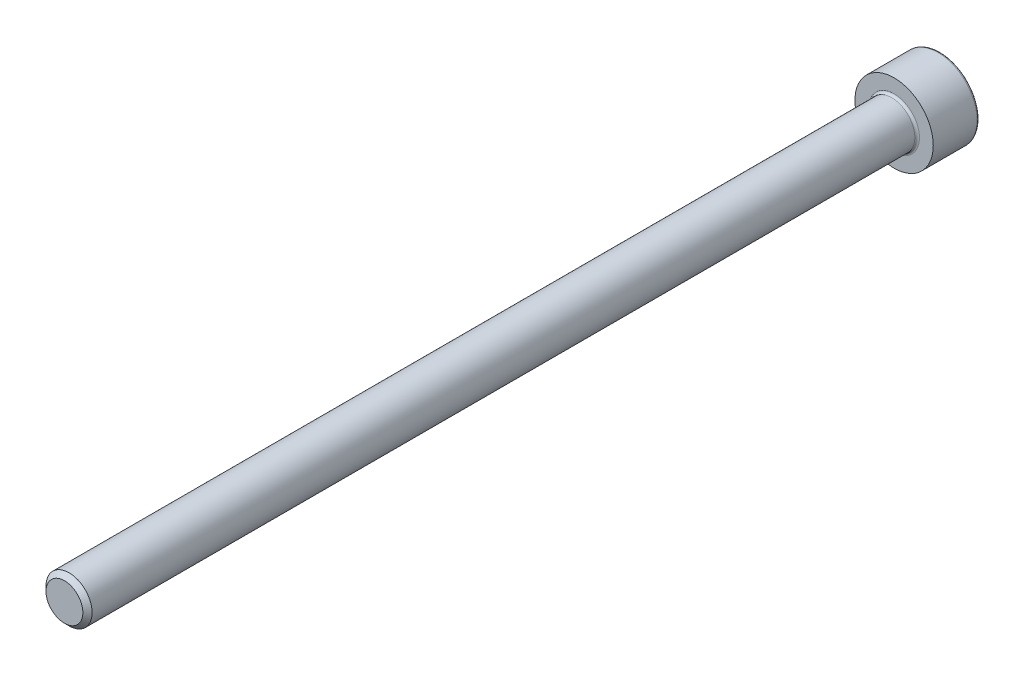
ISO-10303-21;
HEADER;
FILE_DESCRIPTION(('STEP AP214'),'2;1');
FILE_NAME('part.step','',(''),(''),'','','');
FILE_SCHEMA(('AUTOMOTIVE_DESIGN { 1 0 10303 214 1 1 1 1 }'));
ENDSEC;
DATA;
#1=APPLICATION_CONTEXT('core data for automotive mechanical design processes');
#2=APPLICATION_PROTOCOL_DEFINITION('international standard','automotive_design',2000,#1);
#3=PRODUCT_CONTEXT('',#1,'mechanical');
#4=PRODUCT('Part','Part','',(#3));
#5=PRODUCT_RELATED_PRODUCT_CATEGORY('part','',(#4));
#6=PRODUCT_DEFINITION_FORMATION('','',#4);
#7=PRODUCT_DEFINITION_CONTEXT('part definition',#1,'design');
#8=PRODUCT_DEFINITION('design','',#6,#7);
#9=PRODUCT_DEFINITION_SHAPE('','',#8);
#10=(LENGTH_UNIT() NAMED_UNIT(*) SI_UNIT(.MILLI.,.METRE.));
#11=(NAMED_UNIT(*) PLANE_ANGLE_UNIT() SI_UNIT($,.RADIAN.));
#12=(NAMED_UNIT(*) SI_UNIT($,.STERADIAN.) SOLID_ANGLE_UNIT());
#13=UNCERTAINTY_MEASURE_WITH_UNIT(LENGTH_MEASURE(1.E-05),#10,'distance_accuracy_value','');
#14=(GEOMETRIC_REPRESENTATION_CONTEXT(3) GLOBAL_UNCERTAINTY_ASSIGNED_CONTEXT((#13)) GLOBAL_UNIT_ASSIGNED_CONTEXT((#10,
#11,#12)) REPRESENTATION_CONTEXT('',''));
#15=CARTESIAN_POINT('',(0.,0.,0.));
#16=DIRECTION('',(0.,0.,1.));
#17=DIRECTION('',(1.,0.,0.));
#18=AXIS2_PLACEMENT_3D('',#15,#16,#17);
#19=CARTESIAN_POINT('',(0.,0.,-92.5));
#20=DIRECTION('',(0.,0.,1.));
#21=DIRECTION('',(1.,0.,0.));
#22=AXIS2_PLACEMENT_3D('',#19,#20,#21);
#23=PLANE('',#22);
#24=CARTESIAN_POINT('',(0.,0.,-92.5000000011473));
#25=DIRECTION('',(0.,0.,-1.));
#26=DIRECTION('',(-1.,0.,0.));
#27=AXIS2_PLACEMENT_3D('',#24,#25,#26);
#28=CIRCLE('',#27,1.99999999935001);
#29=CARTESIAN_POINT('',(-1.73205192905795,-0.999998056863642,-92.5000000005736));
#30=VERTEX_POINT('',#29);
#31=CARTESIAN_POINT('',(-9.3085380091339E-07,-2.,-92.5000000005736));
#32=VERTEX_POINT('',#31);
#33=EDGE_CURVE('E108',#30,#32,#28,.F.);
#34=ORIENTED_EDGE('',*,*,#33,.T.);
#35=DIRECTION('',(1.,0.,0.));
#36=VECTOR('',#35,1.);
#37=CARTESIAN_POINT('',(0.,-2.,-92.5));
#38=LINE('',#37,#36);
#39=CARTESIAN_POINT('',(-1.15470053838004,-2.00000000000002,-92.5));
#40=VERTEX_POINT('',#39);
#41=EDGE_CURVE('E95',#40,#32,#38,.T.);
#42=ORIENTED_EDGE('',*,*,#41,.F.);
#43=DIRECTION('',(0.499999999995589,-0.866025403786985,0.));
#44=VECTOR('',#43,1.);
#45=CARTESIAN_POINT('',(-1.73205305112,-0.999996114045,-92.5));
#46=LINE('',#45,#44);
#47=EDGE_CURVE('E105',#30,#40,#46,.T.);
#48=ORIENTED_EDGE('',*,*,#47,.F.);
#49=EDGE_LOOP('',(#34,#42,#48));
#50=FACE_BOUND('',#49,.T.);
#51=ADVANCED_FACE('F17',(#50),#23,.F.);
#52=CARTESIAN_POINT('',(0.,0.,-92.5));
#53=DIRECTION('',(0.,0.,1.));
#54=DIRECTION('',(1.,0.,0.));
#55=AXIS2_PLACEMENT_3D('',#52,#53,#54);
#56=PLANE('',#55);
#57=CARTESIAN_POINT('',(0.,0.,-92.5000000011473));
#58=DIRECTION('',(0.,0.,-1.));
#59=DIRECTION('',(-1.,0.,0.));
#60=AXIS2_PLACEMENT_3D('',#57,#58,#59);
#61=CIRCLE('',#60,1.99999999935001);
#62=CARTESIAN_POINT('',(1.73205080756945,-0.999999999997002,-92.5000000005736));
#63=VERTEX_POINT('',#62);
#64=EDGE_CURVE('E114',#32,#63,#61,.F.);
#65=ORIENTED_EDGE('',*,*,#64,.T.);
#66=DIRECTION('',(0.49999999999734,0.866025403785975,0.));
#67=VECTOR('',#66,1.);
#68=CARTESIAN_POINT('',(1.15470053838,-2.,-92.5));
#69=LINE('',#68,#67);
#70=CARTESIAN_POINT('',(1.15470053838,-2.,-92.5));
#71=VERTEX_POINT('',#70);
#72=EDGE_CURVE('E122',#71,#63,#69,.T.);
#73=ORIENTED_EDGE('',*,*,#72,.F.);
#74=DIRECTION('',(1.,0.,0.));
#75=VECTOR('',#74,1.);
#76=CARTESIAN_POINT('',(0.,-2.,-92.5));
#77=LINE('',#76,#75);
#78=EDGE_CURVE('E100',#32,#71,#77,.T.);
#79=ORIENTED_EDGE('',*,*,#78,.F.);
#80=EDGE_LOOP('',(#65,#73,#79));
#81=FACE_BOUND('',#80,.T.);
#82=ADVANCED_FACE('F120',(#81),#56,.F.);
#83=CARTESIAN_POINT('',(0.,0.,-92.5));
#84=DIRECTION('',(0.,0.,1.));
#85=DIRECTION('',(1.,0.,0.));
#86=AXIS2_PLACEMENT_3D('',#83,#84,#85);
#87=PLANE('',#86);
#88=CARTESIAN_POINT('',(0.,0.,-92.5));
#89=DIRECTION('',(0.,0.,1.));
#90=DIRECTION('',(1.,0.,0.));
#91=AXIS2_PLACEMENT_3D('',#88,#89,#90);
#92=CIRCLE('',#91,1.99999999736283);
#93=CARTESIAN_POINT('',(1.75549951517932,-0.959052021438868,-92.5000820987267));
#94=VERTEX_POINT('',#93);
#95=CARTESIAN_POINT('',(1.7320508064274,0.999999999340952,-92.5000000005736));
#96=VERTEX_POINT('',#95);
#97=EDGE_CURVE('E130',#94,#96,#92,.T.);
#98=ORIENTED_EDGE('',*,*,#97,.T.);
#99=DIRECTION('',(-0.500000000000243,0.866025403784298,0.));
#100=VECTOR('',#99,1.);
#101=CARTESIAN_POINT('',(2.30940107676,0.,-92.5));
#102=LINE('',#101,#100);
#103=CARTESIAN_POINT('',(2.30940107675996,0.,-92.5));
#104=VERTEX_POINT('',#103);
#105=EDGE_CURVE('E123',#104,#96,#102,.T.);
#106=ORIENTED_EDGE('',*,*,#105,.F.);
#107=DIRECTION('',(0.50000000000019,0.866025403784329,0.));
#108=VECTOR('',#107,1.);
#109=CARTESIAN_POINT('',(1.15470053838,-2.,-92.5));
#110=LINE('',#109,#108);
#111=EDGE_CURVE('E140',#94,#104,#110,.T.);
#112=ORIENTED_EDGE('',*,*,#111,.F.);
#113=EDGE_LOOP('',(#98,#106,#112));
#114=FACE_BOUND('',#113,.T.);
#115=ADVANCED_FACE('F417',(#114),#87,.F.);
#116=CARTESIAN_POINT('',(0.,0.,-92.5));
#117=DIRECTION('',(0.,0.,1.));
#118=DIRECTION('',(1.,0.,0.));
#119=AXIS2_PLACEMENT_3D('',#116,#117,#118);
#120=PLANE('',#119);
#121=CARTESIAN_POINT('',(0.,0.,-92.5000000011473));
#122=DIRECTION('',(0.,0.,-1.));
#123=DIRECTION('',(-1.,0.,0.));
#124=AXIS2_PLACEMENT_3D('',#121,#122,#123);
#125=CIRCLE('',#124,1.99999999935001);
#126=CARTESIAN_POINT('',(0.,1.99999999967501,-92.5000000005736));
#127=VERTEX_POINT('',#126);
#128=EDGE_CURVE('E470',#96,#127,#125,.F.);
#129=ORIENTED_EDGE('',*,*,#128,.T.);
#130=DIRECTION('',(1.,0.,0.));
#131=VECTOR('',#130,1.);
#132=CARTESIAN_POINT('',(0.,2.,-92.5));
#133=LINE('',#132,#131);
#134=CARTESIAN_POINT('',(1.15470053838004,2.00000000000002,-92.5));
#135=VERTEX_POINT('',#134);
#136=EDGE_CURVE('E143',#135,#127,#133,.F.);
#137=ORIENTED_EDGE('',*,*,#136,.F.);
#138=DIRECTION('',(-0.500000000000243,0.866025403784298,0.));
#139=VECTOR('',#138,1.);
#140=CARTESIAN_POINT('',(1.73205080757,1.,-92.5));
#141=LINE('',#140,#139);
#142=EDGE_CURVE('E195',#96,#135,#141,.T.);
#143=ORIENTED_EDGE('',*,*,#142,.F.);
#144=EDGE_LOOP('',(#129,#137,#143));
#145=FACE_BOUND('',#144,.T.);
#146=ADVANCED_FACE('F408',(#145),#120,.F.);
#147=CARTESIAN_POINT('',(0.,0.,-92.5));
#148=DIRECTION('',(0.,0.,1.));
#149=DIRECTION('',(1.,0.,0.));
#150=AXIS2_PLACEMENT_3D('',#147,#148,#149);
#151=PLANE('',#150);
#152=CARTESIAN_POINT('',(0.,0.,-92.5000000011473));
#153=DIRECTION('',(0.,0.,-1.));
#154=DIRECTION('',(-1.,0.,0.));
#155=AXIS2_PLACEMENT_3D('',#152,#153,#154);
#156=CIRCLE('',#155,1.99999999935001);
#157=CARTESIAN_POINT('',(-1.73205080756942,1.00000000000093,-92.5000000005736));
#158=VERTEX_POINT('',#157);
#159=EDGE_CURVE('E235',#127,#158,#156,.F.);
#160=ORIENTED_EDGE('',*,*,#159,.T.);
#161=DIRECTION('',(-0.500000000000243,-0.866025403784298,0.));
#162=VECTOR('',#161,1.);
#163=CARTESIAN_POINT('',(-1.15470053838,2.,-92.5));
#164=LINE('',#163,#162);
#165=CARTESIAN_POINT('',(-1.15470053838,2.,-92.5));
#166=VERTEX_POINT('',#165);
#167=EDGE_CURVE('E191',#166,#158,#164,.T.);
#168=ORIENTED_EDGE('',*,*,#167,.F.);
#169=DIRECTION('',(1.,0.,0.));
#170=VECTOR('',#169,1.);
#171=CARTESIAN_POINT('',(0.,2.,-92.5));
#172=LINE('',#171,#170);
#173=EDGE_CURVE('E115',#127,#166,#172,.F.);
#174=ORIENTED_EDGE('',*,*,#173,.F.);
#175=EDGE_LOOP('',(#160,#168,#174));
#176=FACE_BOUND('',#175,.T.);
#177=ADVANCED_FACE('F260',(#176),#151,.F.);
#178=CARTESIAN_POINT('',(0.,0.,-92.5070898501303));
#179=DIRECTION('',(0.,0.,-1.));
#180=DIRECTION('',(-1.,0.,0.));
#181=AXIS2_PLACEMENT_3D('',#178,#179,#180);
#182=CONICAL_SURFACE('',#181,2.01227997796447,1.0471975497099);
#183=CARTESIAN_POINT('',(-3.41060513164848E-10,1.70530256582424E-10,-91.3452994597606));
#184=VERTEX_POINT('',#183);
#185=VERTEX_LOOP('',#184);
#186=FACE_BOUND('',#185,.T.);
#187=CARTESIAN_POINT('',(-1.73205080756977,1.00000000000026,-92.5000000015231));
#188=CARTESIAN_POINT('',(-1.73598288580617,0.993189440715484,-92.5000000095924));
#189=CARTESIAN_POINT('',(-1.73991487290214,0.98637903929055,-92.5000267870715));
#190=CARTESIAN_POINT('',(-1.74777866480058,0.972758552182319,-92.5001338808495));
#191=CARTESIAN_POINT('',(-1.75171046960304,0.965948466499022,-92.5002141971481));
#192=CARTESIAN_POINT('',(-1.75564218326507,0.959138538675565,-92.5003212828565));
#193=B_SPLINE_CURVE_WITH_KNOTS('',3,(#187,#188,#189,#190,#191,#192),.UNSPECIFIED.,.F.,.F.,(4,2,
4),(0.,0.0235920593447374,0.047184118613414),.UNSPECIFIED.);
#194=CARTESIAN_POINT('',(-1.7554935244544,0.959049109002411,-92.5000922635321));
#195=VERTEX_POINT('',#194);
#196=EDGE_CURVE('E182',#158,#195,#193,.T.);
#197=ORIENTED_EDGE('',*,*,#196,.F.);
#198=ORIENTED_EDGE('',*,*,#159,.F.);
#199=ORIENTED_EDGE('',*,*,#128,.F.);
#200=ORIENTED_EDGE('',*,*,#97,.F.);
#201=CARTESIAN_POINT('',(1.73205102128285,-0.99999962983835,-92.5000000015231));
#202=CARTESIAN_POINT('',(1.73598309178616,-0.993189083947678,-92.5000000105628));
#203=CARTESIAN_POINT('',(1.73991507114793,-0.986378695918774,-92.5000267889068));
#204=CARTESIAN_POINT('',(1.74777884757574,-0.972758235606456,-92.5001338842035));
#205=CARTESIAN_POINT('',(1.75171064464177,-0.965948163323043,-92.5002142011559));
#206=CARTESIAN_POINT('',(1.75564235056627,-0.959138248901396,-92.5003212874126));
#207=B_SPLINE_CURVE_WITH_KNOTS('',3,(#201,#202,#203,#204,#205,#206),.UNSPECIFIED.,.F.,.F.,(4,2,
4),(0.,0.0235920129486334,0.0471840258212055),.UNSPECIFIED.);
#208=EDGE_CURVE('E128',#63,#94,#207,.T.);
#209=ORIENTED_EDGE('',*,*,#208,.F.);
#210=ORIENTED_EDGE('',*,*,#64,.F.);
#211=ORIENTED_EDGE('',*,*,#33,.F.);
#212=CARTESIAN_POINT('',(0.,0.,-92.5));
#213=DIRECTION('',(0.,0.,1.));
#214=DIRECTION('',(1.,0.,0.));
#215=AXIS2_PLACEMENT_3D('',#212,#213,#214);
#216=CIRCLE('',#215,1.99999999736283);
#217=EDGE_CURVE('E159',#30,#195,#216,.F.);
#218=ORIENTED_EDGE('',*,*,#217,.T.);
#219=EDGE_LOOP('',(#197,#198,#199,#200,#209,#210,#211,#218));
#220=FACE_BOUND('',#219,.T.);
#221=ADVANCED_FACE('F126',(#186,#220),#182,.F.);
#222=CARTESIAN_POINT('',(0.,0.,-92.5));
#223=DIRECTION('',(0.,0.,1.));
#224=DIRECTION('',(1.,0.,0.));
#225=AXIS2_PLACEMENT_3D('',#222,#223,#224);
#226=PLANE('',#225);
#227=ORIENTED_EDGE('',*,*,#217,.F.);
#228=DIRECTION('',(0.500000000004897,-0.866025403781611,0.));
#229=VECTOR('',#228,1.);
#230=CARTESIAN_POINT('',(-2.30940107676,0.,-92.5));
#231=LINE('',#230,#229);
#232=CARTESIAN_POINT('',(-2.30940107675996,0.,-92.5));
#233=VERTEX_POINT('',#232);
#234=EDGE_CURVE('E181',#233,#30,#231,.T.);
#235=ORIENTED_EDGE('',*,*,#234,.F.);
#236=DIRECTION('',(0.50000000000019,0.866025403784329,0.));
#237=VECTOR('',#236,1.);
#238=CARTESIAN_POINT('',(-2.30940107675988,0.,-92.5));
#239=LINE('',#238,#237);
#240=EDGE_CURVE('E154',#233,#195,#239,.T.);
#241=ORIENTED_EDGE('',*,*,#240,.T.);
#242=EDGE_LOOP('',(#227,#235,#241));
#243=FACE_BOUND('',#242,.T.);
#244=ADVANCED_FACE('F250',(#243),#226,.F.);
#245=CARTESIAN_POINT('',(-1.15470053838,2.,-95.));
#246=DIRECTION('',(-0.866025403784329,0.50000000000019,0.));
#247=DIRECTION('',(-0.50000000000019,-0.866025403784329,0.));
#248=AXIS2_PLACEMENT_3D('',#245,#246,#247);
#249=PLANE('',#248);
#250=ORIENTED_EDGE('',*,*,#196,.T.);
#251=ORIENTED_EDGE('',*,*,#240,.F.);
#252=DIRECTION('',(0.,0.,1.));
#253=VECTOR('',#252,1.);
#254=CARTESIAN_POINT('',(-2.30940107676,0.,-95.));
#255=LINE('',#254,#253);
#256=CARTESIAN_POINT('',(-2.30940107675996,0.,-95.));
#257=VERTEX_POINT('',#256);
#258=EDGE_CURVE('E152',#233,#257,#255,.F.);
#259=ORIENTED_EDGE('',*,*,#258,.T.);
#260=DIRECTION('',(-0.50000000000019,-0.866025403784329,0.));
#261=VECTOR('',#260,1.);
#262=CARTESIAN_POINT('',(-1.15470053838,2.,-95.));
#263=LINE('',#262,#261);
#264=CARTESIAN_POINT('',(-1.15470053838,2.,-95.));
#265=VERTEX_POINT('',#264);
#266=EDGE_CURVE('E147',#265,#257,#263,.T.);
#267=ORIENTED_EDGE('',*,*,#266,.F.);
#268=DIRECTION('',(0.,0.,1.));
#269=VECTOR('',#268,1.);
#270=CARTESIAN_POINT('',(-1.15470053838,2.,-95.));
#271=LINE('',#270,#269);
#272=EDGE_CURVE('E167',#265,#166,#271,.T.);
#273=ORIENTED_EDGE('',*,*,#272,.T.);
#274=ORIENTED_EDGE('',*,*,#167,.T.);
#275=EDGE_LOOP('',(#250,#251,#259,#267,#273,#274));
#276=FACE_BOUND('',#275,.T.);
#277=ADVANCED_FACE('F246',(#276),#249,.F.);
#278=CARTESIAN_POINT('',(1.15470053838,-2.,-95.));
#279=DIRECTION('',(0.866025403784329,-0.50000000000019,0.));
#280=DIRECTION('',(0.50000000000019,0.866025403784329,0.));
#281=AXIS2_PLACEMENT_3D('',#278,#279,#280);
#282=PLANE('',#281);
#283=DIRECTION('',(0.50000000000019,0.866025403784329,0.));
#284=VECTOR('',#283,1.);
#285=CARTESIAN_POINT('',(1.75564383609045,-0.959135675898031,-95.));
#286=LINE('',#285,#284);
#287=CARTESIAN_POINT('',(1.15470053838,-2.,-95.));
#288=VERTEX_POINT('',#287);
#289=CARTESIAN_POINT('',(2.30940107675996,0.,-95.));
#290=VERTEX_POINT('',#289);
#291=EDGE_CURVE('E145',#288,#290,#286,.T.);
#292=ORIENTED_EDGE('',*,*,#291,.F.);
#293=DIRECTION('',(0.,0.,-1.));
#294=VECTOR('',#293,1.);
#295=CARTESIAN_POINT('',(1.15470053838,-2.,-95.));
#296=LINE('',#295,#294);
#297=EDGE_CURVE('E146',#288,#71,#296,.F.);
#298=ORIENTED_EDGE('',*,*,#297,.T.);
#299=ORIENTED_EDGE('',*,*,#72,.T.);
#300=ORIENTED_EDGE('',*,*,#208,.T.);
#301=ORIENTED_EDGE('',*,*,#111,.T.);
#302=DIRECTION('',(0.,0.,1.));
#303=VECTOR('',#302,1.);
#304=CARTESIAN_POINT('',(2.30940107676,0.,-95.));
#305=LINE('',#304,#303);
#306=EDGE_CURVE('E187',#104,#290,#305,.F.);
#307=ORIENTED_EDGE('',*,*,#306,.T.);
#308=EDGE_LOOP('',(#292,#298,#299,#300,#301,#307));
#309=FACE_BOUND('',#308,.T.);
#310=ADVANCED_FACE('F249',(#309),#282,.F.);
#311=CARTESIAN_POINT('',(-1.15470053838,-2.,-95.));
#312=DIRECTION('',(0.,-1.,0.));
#313=DIRECTION('',(0.,0.,-1.));
#314=AXIS2_PLACEMENT_3D('',#311,#312,#313);
#315=PLANE('',#314);
#316=ORIENTED_EDGE('',*,*,#78,.T.);
#317=ORIENTED_EDGE('',*,*,#297,.F.);
#318=DIRECTION('',(1.,0.,0.));
#319=VECTOR('',#318,1.);
#320=CARTESIAN_POINT('',(0.,-2.,-95.));
#321=LINE('',#320,#319);
#322=CARTESIAN_POINT('',(-1.15470053838003,-2.00000000000002,-95.));
#323=VERTEX_POINT('',#322);
#324=EDGE_CURVE('E180',#288,#323,#321,.F.);
#325=ORIENTED_EDGE('',*,*,#324,.T.);
#326=DIRECTION('',(0.,0.,1.));
#327=VECTOR('',#326,1.);
#328=CARTESIAN_POINT('',(-1.15470053838012,-2.00000000000007,-95.));
#329=LINE('',#328,#327);
#330=EDGE_CURVE('E103',#323,#40,#329,.T.);
#331=ORIENTED_EDGE('',*,*,#330,.T.);
#332=ORIENTED_EDGE('',*,*,#41,.T.);
#333=EDGE_LOOP('',(#316,#317,#325,#331,#332));
#334=FACE_BOUND('',#333,.T.);
#335=ADVANCED_FACE('F97',(#334),#315,.F.);
#336=CARTESIAN_POINT('',(-2.30940107676,0.,-95.));
#337=DIRECTION('',(-0.866025403784329,-0.50000000000019,0.));
#338=DIRECTION('',(0.50000000000019,-0.866025403784329,0.));
#339=AXIS2_PLACEMENT_3D('',#336,#337,#338);
#340=PLANE('',#339);
#341=ORIENTED_EDGE('',*,*,#47,.T.);
#342=ORIENTED_EDGE('',*,*,#330,.F.);
#343=DIRECTION('',(-0.500000000000243,0.866025403784298,0.));
#344=VECTOR('',#343,1.);
#345=CARTESIAN_POINT('',(-1.15470053838,-2.,-95.));
#346=LINE('',#345,#344);
#347=EDGE_CURVE('E174',#323,#257,#346,.T.);
#348=ORIENTED_EDGE('',*,*,#347,.T.);
#349=ORIENTED_EDGE('',*,*,#258,.F.);
#350=ORIENTED_EDGE('',*,*,#234,.T.);
#351=EDGE_LOOP('',(#341,#342,#348,#349,#350));
#352=FACE_BOUND('',#351,.T.);
#353=ADVANCED_FACE('F369',(#352),#340,.F.);
#354=CARTESIAN_POINT('',(1.15470053838,2.,-95.));
#355=DIRECTION('',(0.,1.,0.));
#356=DIRECTION('',(0.,0.,1.));
#357=AXIS2_PLACEMENT_3D('',#354,#355,#356);
#358=PLANE('',#357);
#359=ORIENTED_EDGE('',*,*,#173,.T.);
#360=ORIENTED_EDGE('',*,*,#272,.F.);
#361=DIRECTION('',(1.,0.,0.));
#362=VECTOR('',#361,1.);
#363=CARTESIAN_POINT('',(0.,2.,-95.));
#364=LINE('',#363,#362);
#365=CARTESIAN_POINT('',(1.15470053838003,2.00000000000002,-95.));
#366=VERTEX_POINT('',#365);
#367=EDGE_CURVE('E35',#265,#366,#364,.T.);
#368=ORIENTED_EDGE('',*,*,#367,.T.);
#369=DIRECTION('',(0.,0.,1.));
#370=VECTOR('',#369,1.);
#371=CARTESIAN_POINT('',(1.15470053838012,2.00000000000007,-95.));
#372=LINE('',#371,#370);
#373=EDGE_CURVE('E170',#366,#135,#372,.T.);
#374=ORIENTED_EDGE('',*,*,#373,.T.);
#375=ORIENTED_EDGE('',*,*,#136,.T.);
#376=EDGE_LOOP('',(#359,#360,#368,#374,#375));
#377=FACE_BOUND('',#376,.T.);
#378=ADVANCED_FACE('F365',(#377),#358,.F.);
#379=CARTESIAN_POINT('',(2.30940107676,0.,-95.));
#380=DIRECTION('',(0.866025403784329,0.50000000000019,0.));
#381=DIRECTION('',(-0.50000000000019,0.866025403784329,0.));
#382=AXIS2_PLACEMENT_3D('',#379,#380,#381);
#383=PLANE('',#382);
#384=ORIENTED_EDGE('',*,*,#306,.F.);
#385=ORIENTED_EDGE('',*,*,#105,.T.);
#386=ORIENTED_EDGE('',*,*,#142,.T.);
#387=ORIENTED_EDGE('',*,*,#373,.F.);
#388=DIRECTION('',(0.500000000000243,-0.866025403784298,0.));
#389=VECTOR('',#388,1.);
#390=CARTESIAN_POINT('',(1.15470053838,2.,-95.));
#391=LINE('',#390,#389);
#392=EDGE_CURVE('E163',#366,#290,#391,.T.);
#393=ORIENTED_EDGE('',*,*,#392,.T.);
#394=EDGE_LOOP('',(#384,#385,#386,#387,#393));
#395=FACE_BOUND('',#394,.T.);
#396=ADVANCED_FACE('F350',(#395),#383,.F.);
#397=CARTESIAN_POINT('',(0.,0.,-95.));
#398=DIRECTION('',(0.,0.,1.));
#399=DIRECTION('',(1.,0.,0.));
#400=AXIS2_PLACEMENT_3D('',#397,#398,#399);
#401=PLANE('',#400);
#402=ORIENTED_EDGE('',*,*,#367,.F.);
#403=ORIENTED_EDGE('',*,*,#266,.T.);
#404=ORIENTED_EDGE('',*,*,#347,.F.);
#405=ORIENTED_EDGE('',*,*,#324,.F.);
#406=ORIENTED_EDGE('',*,*,#291,.T.);
#407=ORIENTED_EDGE('',*,*,#392,.F.);
#408=EDGE_LOOP('',(#402,#403,#404,#405,#406,#407));
#409=FACE_BOUND('',#408,.T.);
#410=CARTESIAN_POINT('',(0.,0.,-95.));
#411=DIRECTION('',(0.,0.,1.));
#412=DIRECTION('',(1.,0.,0.));
#413=AXIS2_PLACEMENT_3D('',#410,#411,#412);
#414=CIRCLE('',#413,4.);
#415=CARTESIAN_POINT('',(4.,0.,-95.));
#416=VERTEX_POINT('',#415);
#417=EDGE_CURVE('E327',#416,#416,#414,.T.);
#418=ORIENTED_EDGE('',*,*,#417,.F.);
#419=EDGE_LOOP('',(#418));
#420=FACE_BOUND('',#419,.T.);
#421=ADVANCED_FACE('F313',(#409,#420),#401,.F.);
#422=CARTESIAN_POINT('',(0.,0.,-94.75));
#423=DIRECTION('',(0.,0.,-1.));
#424=DIRECTION('',(1.,0.,0.));
#425=AXIS2_PLACEMENT_3D('',#422,#423,#424);
#426=TOROIDAL_SURFACE('',#425,4.,0.25);
#427=CARTESIAN_POINT('',(0.,0.,-94.75));
#428=DIRECTION('',(0.,0.,1.));
#429=DIRECTION('',(1.,0.,0.));
#430=AXIS2_PLACEMENT_3D('',#427,#428,#429);
#431=CIRCLE('',#430,4.25);
#432=CARTESIAN_POINT('',(4.25,0.,-94.75));
#433=VERTEX_POINT('',#432);
#434=EDGE_CURVE('E227',#433,#433,#431,.T.);
#435=ORIENTED_EDGE('',*,*,#434,.F.);
#436=EDGE_LOOP('',(#435));
#437=FACE_BOUND('',#436,.T.);
#438=ORIENTED_EDGE('',*,*,#417,.T.);
#439=EDGE_LOOP('',(#438));
#440=FACE_BOUND('',#439,.T.);
#441=ADVANCED_FACE('F307',(#437,#440),#426,.T.);
#442=CARTESIAN_POINT('',(0.,0.,-47.5));
#443=DIRECTION('',(0.,0.,1.));
#444=DIRECTION('',(1.,0.,0.));
#445=AXIS2_PLACEMENT_3D('',#442,#443,#444);
#446=CYLINDRICAL_SURFACE('',#445,4.25);
#447=CARTESIAN_POINT('',(0.,0.,-90.));
#448=DIRECTION('',(0.,0.,1.));
#449=DIRECTION('',(1.,0.,0.));
#450=AXIS2_PLACEMENT_3D('',#447,#448,#449);
#451=CIRCLE('',#450,4.25);
#452=CARTESIAN_POINT('',(4.25,0.,-90.));
#453=VERTEX_POINT('',#452);
#454=EDGE_CURVE('E225',#453,#453,#451,.F.);
#455=ORIENTED_EDGE('',*,*,#454,.T.);
#456=EDGE_LOOP('',(#455));
#457=FACE_BOUND('',#456,.T.);
#458=ORIENTED_EDGE('',*,*,#434,.T.);
#459=EDGE_LOOP('',(#458));
#460=FACE_BOUND('',#459,.T.);
#461=ADVANCED_FACE('F304',(#457,#460),#446,.T.);
#462=CARTESIAN_POINT('',(0.,0.,-90.));
#463=DIRECTION('',(0.,0.,-1.));
#464=DIRECTION('',(-1.,0.,0.));
#465=AXIS2_PLACEMENT_3D('',#462,#463,#464);
#466=PLANE('',#465);
#467=CARTESIAN_POINT('',(0.,0.,-90.));
#468=DIRECTION('',(0.,0.,1.));
#469=DIRECTION('',(1.,0.,0.));
#470=AXIS2_PLACEMENT_3D('',#467,#468,#469);
#471=CIRCLE('',#470,2.75);
#472=CARTESIAN_POINT('',(2.75,0.,-90.));
#473=VERTEX_POINT('',#472);
#474=EDGE_CURVE('E224',#473,#473,#471,.F.);
#475=ORIENTED_EDGE('',*,*,#474,.T.);
#476=EDGE_LOOP('',(#475));
#477=FACE_BOUND('',#476,.T.);
#478=ORIENTED_EDGE('',*,*,#454,.F.);
#479=EDGE_LOOP('',(#478));
#480=FACE_BOUND('',#479,.T.);
#481=ADVANCED_FACE('F295',(#477,#480),#466,.F.);
#482=CARTESIAN_POINT('',(0.,0.,0.));
#483=DIRECTION('',(0.,0.,1.));
#484=DIRECTION('',(1.,0.,0.));
#485=AXIS2_PLACEMENT_3D('',#482,#483,#484);
#486=PLANE('',#485);
#487=CARTESIAN_POINT('',(0.,0.,-9.09494701772928E-10));
#488=DIRECTION('',(0.,0.,-1.));
#489=DIRECTION('',(-1.,0.,0.));
#490=AXIS2_PLACEMENT_3D('',#487,#488,#489);
#491=CIRCLE('',#490,1.99999999909715);
#492=CARTESIAN_POINT('',(-1.99999999909715,0.,-9.09494701772928E-10));
#493=VERTEX_POINT('',#492);
#494=EDGE_CURVE('E221',#493,#493,#491,.T.);
#495=ORIENTED_EDGE('',*,*,#494,.F.);
#496=EDGE_LOOP('',(#495));
#497=FACE_BOUND('',#496,.T.);
#498=ADVANCED_FACE('F279',(#497),#486,.T.);
#499=CARTESIAN_POINT('',(0.,0.,-89.75));
#500=DIRECTION('',(0.,0.,1.));
#501=DIRECTION('',(-1.,0.,0.));
#502=AXIS2_PLACEMENT_3D('',#499,#500,#501);
#503=TOROIDAL_SURFACE('',#502,2.75,0.25);
#504=ORIENTED_EDGE('',*,*,#474,.F.);
#505=EDGE_LOOP('',(#504));
#506=FACE_BOUND('',#505,.T.);
#507=CARTESIAN_POINT('',(0.,0.,-89.75));
#508=DIRECTION('',(0.,0.,-1.));
#509=DIRECTION('',(-1.,0.,0.));
#510=AXIS2_PLACEMENT_3D('',#507,#508,#509);
#511=CIRCLE('',#510,2.5);
#512=CARTESIAN_POINT('',(-2.5,0.,-89.75));
#513=VERTEX_POINT('',#512);
#514=EDGE_CURVE('E26',#513,#513,#511,.F.);
#515=ORIENTED_EDGE('',*,*,#514,.F.);
#516=EDGE_LOOP('',(#515));
#517=FACE_BOUND('',#516,.T.);
#518=ADVANCED_FACE('F270',(#506,#517),#503,.F.);
#519=CARTESIAN_POINT('',(0.,0.,-0.500000001238732));
#520=DIRECTION('',(0.,0.,-1.));
#521=DIRECTION('',(-1.,0.,0.));
#522=AXIS2_PLACEMENT_3D('',#519,#520,#521);
#523=CONICAL_SURFACE('',#522,2.49999999854836,0.785398162519414);
#524=CARTESIAN_POINT('',(0.,0.,-0.5));
#525=DIRECTION('',(0.,0.,-1.));
#526=DIRECTION('',(-1.,0.,0.));
#527=AXIS2_PLACEMENT_3D('',#524,#525,#526);
#528=CIRCLE('',#527,2.5);
#529=CARTESIAN_POINT('',(-2.5,0.,-0.5));
#530=VERTEX_POINT('',#529);
#531=EDGE_CURVE('E11',#530,#530,#528,.T.);
#532=ORIENTED_EDGE('',*,*,#531,.F.);
#533=EDGE_LOOP('',(#532));
#534=FACE_BOUND('',#533,.T.);
#535=ORIENTED_EDGE('',*,*,#494,.T.);
#536=EDGE_LOOP('',(#535));
#537=FACE_BOUND('',#536,.T.);
#538=ADVANCED_FACE('F264',(#534,#537),#523,.T.);
#539=CARTESIAN_POINT('',(0.,0.,-45.));
#540=DIRECTION('',(0.,0.,-1.));
#541=DIRECTION('',(-1.,0.,0.));
#542=AXIS2_PLACEMENT_3D('',#539,#540,#541);
#543=CYLINDRICAL_SURFACE('',#542,2.5);
#544=ORIENTED_EDGE('',*,*,#531,.T.);
#545=EDGE_LOOP('',(#544));
#546=FACE_BOUND('',#545,.T.);
#547=ORIENTED_EDGE('',*,*,#514,.T.);
#548=EDGE_LOOP('',(#547));
#549=FACE_BOUND('',#548,.T.);
#550=ADVANCED_FACE('F262',(#546,#549),#543,.T.);
#551=CLOSED_SHELL('',(#51,#82,#115,#146,#177,#221,#244,#277,#310,#335,#353,#378,#396,#421,#441,
#461,#481,#498,#518,#538,#550));
#552=MANIFOLD_SOLID_BREP('B1',#551);
#553=ADVANCED_BREP_SHAPE_REPRESENTATION('',(#18,#552),#14);
#554=SHAPE_DEFINITION_REPRESENTATION(#9,#553);
ENDSEC;
END-ISO-10303-21;
